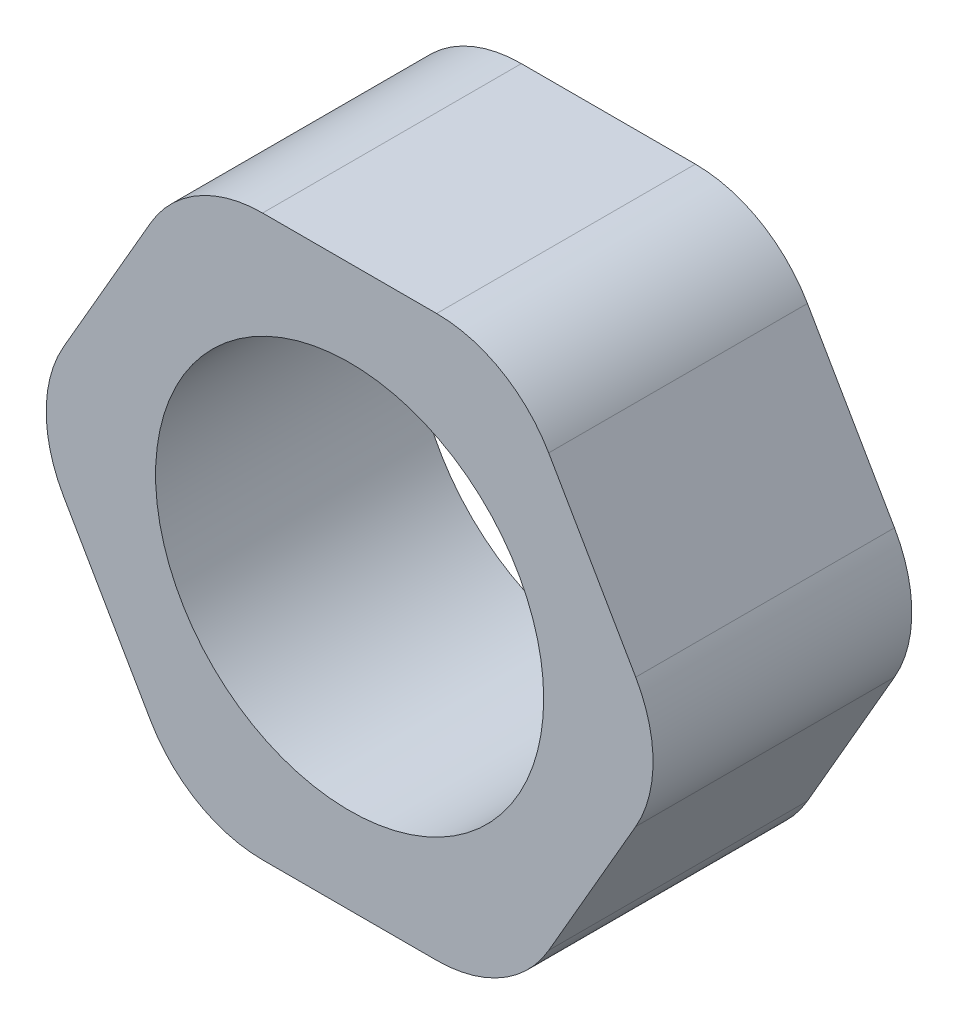
ISO-10303-21;
HEADER;
FILE_DESCRIPTION(('STEP AP214'),'2;1');
FILE_NAME('part.step','',(''),(''),'','','');
FILE_SCHEMA(('AUTOMOTIVE_DESIGN { 1 0 10303 214 1 1 1 1 }'));
ENDSEC;
DATA;
#1=APPLICATION_CONTEXT('core data for automotive mechanical design processes');
#2=APPLICATION_PROTOCOL_DEFINITION('international standard','automotive_design',2000,#1);
#3=PRODUCT_CONTEXT('',#1,'mechanical');
#4=PRODUCT('Part','Part','',(#3));
#5=PRODUCT_RELATED_PRODUCT_CATEGORY('part','',(#4));
#6=PRODUCT_DEFINITION_FORMATION('','',#4);
#7=PRODUCT_DEFINITION_CONTEXT('part definition',#1,'design');
#8=PRODUCT_DEFINITION('design','',#6,#7);
#9=PRODUCT_DEFINITION_SHAPE('','',#8);
#10=(LENGTH_UNIT() NAMED_UNIT(*) SI_UNIT(.MILLI.,.METRE.));
#11=(NAMED_UNIT(*) PLANE_ANGLE_UNIT() SI_UNIT($,.RADIAN.));
#12=(NAMED_UNIT(*) SI_UNIT($,.STERADIAN.) SOLID_ANGLE_UNIT());
#13=UNCERTAINTY_MEASURE_WITH_UNIT(LENGTH_MEASURE(1.E-05),#10,'distance_accuracy_value','');
#14=(GEOMETRIC_REPRESENTATION_CONTEXT(3) GLOBAL_UNCERTAINTY_ASSIGNED_CONTEXT((#13)) GLOBAL_UNIT_ASSIGNED_CONTEXT((#10,
#11,#12)) REPRESENTATION_CONTEXT('',''));
#15=CARTESIAN_POINT('',(0.,0.,0.));
#16=DIRECTION('',(0.,0.,1.));
#17=DIRECTION('',(1.,0.,0.));
#18=AXIS2_PLACEMENT_3D('',#15,#16,#17);
#19=CARTESIAN_POINT('',(0.,0.,2.));
#20=DIRECTION('',(0.,0.,1.));
#21=DIRECTION('',(1.,0.,0.));
#22=AXIS2_PLACEMENT_3D('',#19,#20,#21);
#23=PLANE('',#22);
#24=DIRECTION('',(0.5,0.866025403784439,0.));
#25=VECTOR('',#24,1.);
#26=CARTESIAN_POINT('',(1.25,-2.1650635094611,2.));
#27=LINE('',#26,#25);
#28=CARTESIAN_POINT('',(1.53867513459481,-1.6650635094611,2.));
#29=VERTEX_POINT('',#28);
#30=CARTESIAN_POINT('',(2.21132486540519,-0.5,2.));
#31=VERTEX_POINT('',#30);
#32=EDGE_CURVE('E168',#29,#31,#27,.T.);
#33=ORIENTED_EDGE('',*,*,#32,.T.);
#34=CARTESIAN_POINT('',(1.34529946162075,0.,2.));
#35=DIRECTION('',(0.,0.,1.));
#36=DIRECTION('',(1.,0.,0.));
#37=AXIS2_PLACEMENT_3D('',#34,#35,#36);
#38=CIRCLE('',#37,1.);
#39=CARTESIAN_POINT('',(2.21132486540519,0.5,2.));
#40=VERTEX_POINT('',#39);
#41=EDGE_CURVE('E201',#31,#40,#38,.T.);
#42=ORIENTED_EDGE('',*,*,#41,.T.);
#43=DIRECTION('',(-0.5,0.866025403784439,0.));
#44=VECTOR('',#43,1.);
#45=CARTESIAN_POINT('',(2.5,0.,2.));
#46=LINE('',#45,#44);
#47=CARTESIAN_POINT('',(1.53867513459481,1.6650635094611,2.));
#48=VERTEX_POINT('',#47);
#49=EDGE_CURVE('E151',#40,#48,#46,.T.);
#50=ORIENTED_EDGE('',*,*,#49,.T.);
#51=CARTESIAN_POINT('',(0.672649730810374,1.1650635094611,2.));
#52=DIRECTION('',(0.,0.,1.));
#53=DIRECTION('',(1.,0.,0.));
#54=AXIS2_PLACEMENT_3D('',#51,#52,#53);
#55=CIRCLE('',#54,1.);
#56=CARTESIAN_POINT('',(0.672649730810374,2.1650635094611,2.));
#57=VERTEX_POINT('',#56);
#58=EDGE_CURVE('E192',#48,#57,#55,.T.);
#59=ORIENTED_EDGE('',*,*,#58,.T.);
#60=DIRECTION('',(-1.,0.,0.));
#61=VECTOR('',#60,1.);
#62=CARTESIAN_POINT('',(1.25,2.1650635094611,2.));
#63=LINE('',#62,#61);
#64=CARTESIAN_POINT('',(-0.672649730810374,2.1650635094611,2.));
#65=VERTEX_POINT('',#64);
#66=EDGE_CURVE('E223',#57,#65,#63,.T.);
#67=ORIENTED_EDGE('',*,*,#66,.T.);
#68=CARTESIAN_POINT('',(-0.672649730810374,1.1650635094611,2.));
#69=DIRECTION('',(0.,0.,1.));
#70=DIRECTION('',(1.,0.,0.));
#71=AXIS2_PLACEMENT_3D('',#68,#69,#70);
#72=CIRCLE('',#71,1.);
#73=CARTESIAN_POINT('',(-1.53867513459481,1.6650635094611,2.));
#74=VERTEX_POINT('',#73);
#75=EDGE_CURVE('E194',#65,#74,#72,.T.);
#76=ORIENTED_EDGE('',*,*,#75,.T.);
#77=DIRECTION('',(-0.5,-0.866025403784439,0.));
#78=VECTOR('',#77,1.);
#79=CARTESIAN_POINT('',(-1.25,2.1650635094611,2.));
#80=LINE('',#79,#78);
#81=CARTESIAN_POINT('',(-2.21132486540519,0.5,2.));
#82=VERTEX_POINT('',#81);
#83=EDGE_CURVE('E236',#74,#82,#80,.T.);
#84=ORIENTED_EDGE('',*,*,#83,.T.);
#85=CARTESIAN_POINT('',(-1.34529946162075,0.,2.));
#86=DIRECTION('',(0.,0.,1.));
#87=DIRECTION('',(1.,0.,0.));
#88=AXIS2_PLACEMENT_3D('',#85,#86,#87);
#89=CIRCLE('',#88,1.);
#90=CARTESIAN_POINT('',(-2.21132486540519,-0.499999999999999,2.));
#91=VERTEX_POINT('',#90);
#92=EDGE_CURVE('E196',#82,#91,#89,.T.);
#93=ORIENTED_EDGE('',*,*,#92,.T.);
#94=DIRECTION('',(0.5,-0.866025403784439,0.));
#95=VECTOR('',#94,1.);
#96=CARTESIAN_POINT('',(-2.5,0.,2.));
#97=LINE('',#96,#95);
#98=CARTESIAN_POINT('',(-1.53867513459481,-1.6650635094611,2.));
#99=VERTEX_POINT('',#98);
#100=EDGE_CURVE('E238',#91,#99,#97,.T.);
#101=ORIENTED_EDGE('',*,*,#100,.T.);
#102=CARTESIAN_POINT('',(-0.672649730810374,-1.1650635094611,2.));
#103=DIRECTION('',(0.,0.,1.));
#104=DIRECTION('',(1.,0.,0.));
#105=AXIS2_PLACEMENT_3D('',#102,#103,#104);
#106=CIRCLE('',#105,1.);
#107=CARTESIAN_POINT('',(-0.672649730810374,-2.1650635094611,2.));
#108=VERTEX_POINT('',#107);
#109=EDGE_CURVE('E63',#99,#108,#106,.T.);
#110=ORIENTED_EDGE('',*,*,#109,.T.);
#111=DIRECTION('',(1.,0.,0.));
#112=VECTOR('',#111,1.);
#113=CARTESIAN_POINT('',(-1.25,-2.1650635094611,2.));
#114=LINE('',#113,#112);
#115=CARTESIAN_POINT('',(0.672649730810374,-2.1650635094611,2.));
#116=VERTEX_POINT('',#115);
#117=EDGE_CURVE('E240',#108,#116,#114,.T.);
#118=ORIENTED_EDGE('',*,*,#117,.T.);
#119=CARTESIAN_POINT('',(0.672649730810374,-1.1650635094611,2.));
#120=DIRECTION('',(0.,0.,1.));
#121=DIRECTION('',(1.,0.,0.));
#122=AXIS2_PLACEMENT_3D('',#119,#120,#121);
#123=CIRCLE('',#122,1.);
#124=EDGE_CURVE('E199',#116,#29,#123,.T.);
#125=ORIENTED_EDGE('',*,*,#124,.T.);
#126=EDGE_LOOP('',(#33,#42,#50,#59,#67,#76,#84,#93,#101,#110,#118,#125));
#127=FACE_BOUND('',#126,.T.);
#128=CARTESIAN_POINT('',(0.,0.,2.));
#129=DIRECTION('',(0.,0.,1.));
#130=DIRECTION('',(1.,0.,0.));
#131=AXIS2_PLACEMENT_3D('',#128,#129,#130);
#132=CIRCLE('',#131,1.5);
#133=CARTESIAN_POINT('',(1.5,0.,2.));
#134=VERTEX_POINT('',#133);
#135=EDGE_CURVE('E159',#134,#134,#132,.T.);
#136=ORIENTED_EDGE('',*,*,#135,.F.);
#137=EDGE_LOOP('',(#136));
#138=FACE_BOUND('',#137,.T.);
#139=ADVANCED_FACE('F41',(#127,#138),#23,.T.);
#140=CARTESIAN_POINT('',(0.,0.,0.));
#141=DIRECTION('',(0.,0.,1.));
#142=DIRECTION('',(1.,0.,0.));
#143=AXIS2_PLACEMENT_3D('',#140,#141,#142);
#144=PLANE('',#143);
#145=DIRECTION('',(-0.5,0.866025403784439,0.));
#146=VECTOR('',#145,1.);
#147=CARTESIAN_POINT('',(2.5,0.,0.));
#148=LINE('',#147,#146);
#149=CARTESIAN_POINT('',(2.21132486540519,0.5,0.));
#150=VERTEX_POINT('',#149);
#151=CARTESIAN_POINT('',(1.53867513459481,1.6650635094611,0.));
#152=VERTEX_POINT('',#151);
#153=EDGE_CURVE('E148',#150,#152,#148,.T.);
#154=ORIENTED_EDGE('',*,*,#153,.F.);
#155=CARTESIAN_POINT('',(1.34529946162075,0.,0.));
#156=DIRECTION('',(0.,0.,1.));
#157=DIRECTION('',(1.,0.,0.));
#158=AXIS2_PLACEMENT_3D('',#155,#156,#157);
#159=CIRCLE('',#158,1.);
#160=CARTESIAN_POINT('',(2.21132486540519,-0.5,0.));
#161=VERTEX_POINT('',#160);
#162=EDGE_CURVE('E131',#150,#161,#159,.F.);
#163=ORIENTED_EDGE('',*,*,#162,.T.);
#164=DIRECTION('',(0.5,0.866025403784439,0.));
#165=VECTOR('',#164,1.);
#166=CARTESIAN_POINT('',(1.25,-2.1650635094611,0.));
#167=LINE('',#166,#165);
#168=CARTESIAN_POINT('',(1.53867513459481,-1.6650635094611,0.));
#169=VERTEX_POINT('',#168);
#170=EDGE_CURVE('E178',#169,#161,#167,.T.);
#171=ORIENTED_EDGE('',*,*,#170,.F.);
#172=CARTESIAN_POINT('',(0.672649730810374,-1.1650635094611,0.));
#173=DIRECTION('',(0.,0.,1.));
#174=DIRECTION('',(1.,0.,0.));
#175=AXIS2_PLACEMENT_3D('',#172,#173,#174);
#176=CIRCLE('',#175,1.);
#177=CARTESIAN_POINT('',(0.672649730810374,-2.1650635094611,0.));
#178=VERTEX_POINT('',#177);
#179=EDGE_CURVE('E142',#169,#178,#176,.F.);
#180=ORIENTED_EDGE('',*,*,#179,.T.);
#181=DIRECTION('',(1.,0.,0.));
#182=VECTOR('',#181,1.);
#183=CARTESIAN_POINT('',(-1.25,-2.1650635094611,0.));
#184=LINE('',#183,#182);
#185=CARTESIAN_POINT('',(-0.672649730810374,-2.1650635094611,0.));
#186=VERTEX_POINT('',#185);
#187=EDGE_CURVE('E176',#186,#178,#184,.T.);
#188=ORIENTED_EDGE('',*,*,#187,.F.);
#189=CARTESIAN_POINT('',(-0.672649730810374,-1.1650635094611,0.));
#190=DIRECTION('',(0.,0.,1.));
#191=DIRECTION('',(1.,0.,0.));
#192=AXIS2_PLACEMENT_3D('',#189,#190,#191);
#193=CIRCLE('',#192,1.);
#194=CARTESIAN_POINT('',(-1.53867513459481,-1.6650635094611,0.));
#195=VERTEX_POINT('',#194);
#196=EDGE_CURVE('E186',#186,#195,#193,.F.);
#197=ORIENTED_EDGE('',*,*,#196,.T.);
#198=DIRECTION('',(0.5,-0.866025403784439,0.));
#199=VECTOR('',#198,1.);
#200=CARTESIAN_POINT('',(-2.5,0.,0.));
#201=LINE('',#200,#199);
#202=CARTESIAN_POINT('',(-2.21132486540519,-0.499999999999999,0.));
#203=VERTEX_POINT('',#202);
#204=EDGE_CURVE('E173',#203,#195,#201,.T.);
#205=ORIENTED_EDGE('',*,*,#204,.F.);
#206=CARTESIAN_POINT('',(-1.34529946162075,0.,0.));
#207=DIRECTION('',(0.,0.,1.));
#208=DIRECTION('',(1.,0.,0.));
#209=AXIS2_PLACEMENT_3D('',#206,#207,#208);
#210=CIRCLE('',#209,1.);
#211=CARTESIAN_POINT('',(-2.21132486540519,0.5,0.));
#212=VERTEX_POINT('',#211);
#213=EDGE_CURVE('E184',#203,#212,#210,.F.);
#214=ORIENTED_EDGE('',*,*,#213,.T.);
#215=DIRECTION('',(-0.5,-0.866025403784439,0.));
#216=VECTOR('',#215,1.);
#217=CARTESIAN_POINT('',(-1.25,2.1650635094611,0.));
#218=LINE('',#217,#216);
#219=CARTESIAN_POINT('',(-1.53867513459481,1.6650635094611,0.));
#220=VERTEX_POINT('',#219);
#221=EDGE_CURVE('E162',#220,#212,#218,.T.);
#222=ORIENTED_EDGE('',*,*,#221,.F.);
#223=CARTESIAN_POINT('',(-0.672649730810374,1.1650635094611,0.));
#224=DIRECTION('',(0.,0.,1.));
#225=DIRECTION('',(1.,0.,0.));
#226=AXIS2_PLACEMENT_3D('',#223,#224,#225);
#227=CIRCLE('',#226,1.);
#228=CARTESIAN_POINT('',(-0.672649730810374,2.1650635094611,0.));
#229=VERTEX_POINT('',#228);
#230=EDGE_CURVE('E182',#220,#229,#227,.F.);
#231=ORIENTED_EDGE('',*,*,#230,.T.);
#232=DIRECTION('',(-1.,0.,0.));
#233=VECTOR('',#232,1.);
#234=CARTESIAN_POINT('',(1.25,2.1650635094611,0.));
#235=LINE('',#234,#233);
#236=CARTESIAN_POINT('',(0.672649730810374,2.1650635094611,0.));
#237=VERTEX_POINT('',#236);
#238=EDGE_CURVE('E158',#237,#229,#235,.T.);
#239=ORIENTED_EDGE('',*,*,#238,.F.);
#240=CARTESIAN_POINT('',(0.672649730810374,1.1650635094611,0.));
#241=DIRECTION('',(0.,0.,1.));
#242=DIRECTION('',(1.,0.,0.));
#243=AXIS2_PLACEMENT_3D('',#240,#241,#242);
#244=CIRCLE('',#243,1.);
#245=EDGE_CURVE('E152',#237,#152,#244,.F.);
#246=ORIENTED_EDGE('',*,*,#245,.T.);
#247=EDGE_LOOP('',(#154,#163,#171,#180,#188,#197,#205,#214,#222,#231,#239,#246));
#248=FACE_BOUND('',#247,.T.);
#249=CARTESIAN_POINT('',(0.,0.,0.));
#250=DIRECTION('',(0.,0.,1.));
#251=DIRECTION('',(1.,0.,0.));
#252=AXIS2_PLACEMENT_3D('',#249,#250,#251);
#253=CIRCLE('',#252,1.5);
#254=CARTESIAN_POINT('',(1.5,0.,0.));
#255=VERTEX_POINT('',#254);
#256=EDGE_CURVE('E165',#255,#255,#253,.T.);
#257=ORIENTED_EDGE('',*,*,#256,.T.);
#258=EDGE_LOOP('',(#257));
#259=FACE_BOUND('',#258,.T.);
#260=ADVANCED_FACE('F155',(#248,#259),#144,.F.);
#261=CARTESIAN_POINT('',(2.5,0.,2.));
#262=DIRECTION('',(-0.866025403784439,-0.5,0.));
#263=DIRECTION('',(0.5,-0.866025403784439,0.));
#264=AXIS2_PLACEMENT_3D('',#261,#262,#263);
#265=PLANE('',#264);
#266=ORIENTED_EDGE('',*,*,#49,.F.);
#267=DIRECTION('',(0.,0.,-1.));
#268=VECTOR('',#267,1.);
#269=CARTESIAN_POINT('',(2.21132486540519,0.5,2.));
#270=LINE('',#269,#268);
#271=EDGE_CURVE('E135',#40,#150,#270,.T.);
#272=ORIENTED_EDGE('',*,*,#271,.T.);
#273=ORIENTED_EDGE('',*,*,#153,.T.);
#274=DIRECTION('',(0.,0.,-1.));
#275=VECTOR('',#274,1.);
#276=CARTESIAN_POINT('',(1.53867513459481,1.6650635094611,2.));
#277=LINE('',#276,#275);
#278=EDGE_CURVE('E153',#152,#48,#277,.F.);
#279=ORIENTED_EDGE('',*,*,#278,.T.);
#280=EDGE_LOOP('',(#266,#272,#273,#279));
#281=FACE_BOUND('',#280,.T.);
#282=ADVANCED_FACE('F147',(#281),#265,.F.);
#283=CARTESIAN_POINT('',(1.25,2.1650635094611,2.));
#284=DIRECTION('',(0.,-1.,0.));
#285=DIRECTION('',(0.,0.,-1.));
#286=AXIS2_PLACEMENT_3D('',#283,#284,#285);
#287=PLANE('',#286);
#288=ORIENTED_EDGE('',*,*,#238,.T.);
#289=DIRECTION('',(0.,0.,-1.));
#290=VECTOR('',#289,1.);
#291=CARTESIAN_POINT('',(-0.672649730810374,2.1650635094611,2.));
#292=LINE('',#291,#290);
#293=EDGE_CURVE('E11',#229,#65,#292,.F.);
#294=ORIENTED_EDGE('',*,*,#293,.T.);
#295=ORIENTED_EDGE('',*,*,#66,.F.);
#296=DIRECTION('',(0.,0.,-1.));
#297=VECTOR('',#296,1.);
#298=CARTESIAN_POINT('',(0.672649730810374,2.1650635094611,2.));
#299=LINE('',#298,#297);
#300=EDGE_CURVE('E49',#57,#237,#299,.T.);
#301=ORIENTED_EDGE('',*,*,#300,.T.);
#302=EDGE_LOOP('',(#288,#294,#295,#301));
#303=FACE_BOUND('',#302,.T.);
#304=ADVANCED_FACE('F220',(#303),#287,.F.);
#305=CARTESIAN_POINT('',(-1.25,2.1650635094611,2.));
#306=DIRECTION('',(0.866025403784439,-0.5,0.));
#307=DIRECTION('',(0.5,0.866025403784439,0.));
#308=AXIS2_PLACEMENT_3D('',#305,#306,#307);
#309=PLANE('',#308);
#310=ORIENTED_EDGE('',*,*,#221,.T.);
#311=DIRECTION('',(0.,0.,-1.));
#312=VECTOR('',#311,1.);
#313=CARTESIAN_POINT('',(-2.21132486540519,0.5,2.));
#314=LINE('',#313,#312);
#315=EDGE_CURVE('E215',#212,#82,#314,.F.);
#316=ORIENTED_EDGE('',*,*,#315,.T.);
#317=ORIENTED_EDGE('',*,*,#83,.F.);
#318=DIRECTION('',(0.,0.,-1.));
#319=VECTOR('',#318,1.);
#320=CARTESIAN_POINT('',(-1.53867513459481,1.6650635094611,2.));
#321=LINE('',#320,#319);
#322=EDGE_CURVE('E212',#74,#220,#321,.T.);
#323=ORIENTED_EDGE('',*,*,#322,.T.);
#324=EDGE_LOOP('',(#310,#316,#317,#323));
#325=FACE_BOUND('',#324,.T.);
#326=ADVANCED_FACE('F233',(#325),#309,.F.);
#327=CARTESIAN_POINT('',(-2.5,0.,2.));
#328=DIRECTION('',(0.866025403784439,0.5,0.));
#329=DIRECTION('',(-0.5,0.866025403784439,0.));
#330=AXIS2_PLACEMENT_3D('',#327,#328,#329);
#331=PLANE('',#330);
#332=ORIENTED_EDGE('',*,*,#204,.T.);
#333=DIRECTION('',(0.,0.,-1.));
#334=VECTOR('',#333,1.);
#335=CARTESIAN_POINT('',(-1.53867513459481,-1.6650635094611,2.));
#336=LINE('',#335,#334);
#337=EDGE_CURVE('E210',#195,#99,#336,.F.);
#338=ORIENTED_EDGE('',*,*,#337,.T.);
#339=ORIENTED_EDGE('',*,*,#100,.F.);
#340=DIRECTION('',(0.,0.,-1.));
#341=VECTOR('',#340,1.);
#342=CARTESIAN_POINT('',(-2.21132486540519,-0.5,2.));
#343=LINE('',#342,#341);
#344=EDGE_CURVE('E207',#91,#203,#343,.T.);
#345=ORIENTED_EDGE('',*,*,#344,.T.);
#346=EDGE_LOOP('',(#332,#338,#339,#345));
#347=FACE_BOUND('',#346,.T.);
#348=ADVANCED_FACE('F261',(#347),#331,.F.);
#349=CARTESIAN_POINT('',(-1.25,-2.1650635094611,2.));
#350=DIRECTION('',(0.,1.,0.));
#351=DIRECTION('',(0.,0.,1.));
#352=AXIS2_PLACEMENT_3D('',#349,#350,#351);
#353=PLANE('',#352);
#354=ORIENTED_EDGE('',*,*,#187,.T.);
#355=DIRECTION('',(0.,0.,-1.));
#356=VECTOR('',#355,1.);
#357=CARTESIAN_POINT('',(0.672649730810374,-2.1650635094611,2.));
#358=LINE('',#357,#356);
#359=EDGE_CURVE('E56',#178,#116,#358,.F.);
#360=ORIENTED_EDGE('',*,*,#359,.T.);
#361=ORIENTED_EDGE('',*,*,#117,.F.);
#362=DIRECTION('',(0.,0.,-1.));
#363=VECTOR('',#362,1.);
#364=CARTESIAN_POINT('',(-0.672649730810374,-2.1650635094611,2.));
#365=LINE('',#364,#363);
#366=EDGE_CURVE('E203',#108,#186,#365,.T.);
#367=ORIENTED_EDGE('',*,*,#366,.T.);
#368=EDGE_LOOP('',(#354,#360,#361,#367));
#369=FACE_BOUND('',#368,.T.);
#370=ADVANCED_FACE('F254',(#369),#353,.F.);
#371=CARTESIAN_POINT('',(1.25,-2.1650635094611,2.));
#372=DIRECTION('',(-0.866025403784439,0.5,0.));
#373=DIRECTION('',(-0.5,-0.866025403784439,0.));
#374=AXIS2_PLACEMENT_3D('',#371,#372,#373);
#375=PLANE('',#374);
#376=ORIENTED_EDGE('',*,*,#170,.T.);
#377=DIRECTION('',(0.,0.,-1.));
#378=VECTOR('',#377,1.);
#379=CARTESIAN_POINT('',(2.21132486540519,-0.5,2.));
#380=LINE('',#379,#378);
#381=EDGE_CURVE('E136',#161,#31,#380,.F.);
#382=ORIENTED_EDGE('',*,*,#381,.T.);
#383=ORIENTED_EDGE('',*,*,#32,.F.);
#384=DIRECTION('',(0.,0.,-1.));
#385=VECTOR('',#384,1.);
#386=CARTESIAN_POINT('',(1.53867513459481,-1.6650635094611,2.));
#387=LINE('',#386,#385);
#388=EDGE_CURVE('E141',#29,#169,#387,.T.);
#389=ORIENTED_EDGE('',*,*,#388,.T.);
#390=EDGE_LOOP('',(#376,#382,#383,#389));
#391=FACE_BOUND('',#390,.T.);
#392=ADVANCED_FACE('F250',(#391),#375,.F.);
#393=CARTESIAN_POINT('',(0.,0.,2.));
#394=DIRECTION('',(0.,0.,-1.));
#395=DIRECTION('',(-1.,0.,0.));
#396=AXIS2_PLACEMENT_3D('',#393,#394,#395);
#397=CYLINDRICAL_SURFACE('',#396,1.5);
#398=ORIENTED_EDGE('',*,*,#135,.T.);
#399=EDGE_LOOP('',(#398));
#400=FACE_BOUND('',#399,.T.);
#401=ORIENTED_EDGE('',*,*,#256,.F.);
#402=EDGE_LOOP('',(#401));
#403=FACE_BOUND('',#402,.T.);
#404=ADVANCED_FACE('F281',(#400,#403),#397,.F.);
#405=CARTESIAN_POINT('',(1.34529946162075,0.,2.));
#406=DIRECTION('',(0.,0.,-1.));
#407=DIRECTION('',(-1.,0.,0.));
#408=AXIS2_PLACEMENT_3D('',#405,#406,#407);
#409=CYLINDRICAL_SURFACE('',#408,1.);
#410=ORIENTED_EDGE('',*,*,#41,.F.);
#411=ORIENTED_EDGE('',*,*,#381,.F.);
#412=ORIENTED_EDGE('',*,*,#162,.F.);
#413=ORIENTED_EDGE('',*,*,#271,.F.);
#414=EDGE_LOOP('',(#410,#411,#412,#413));
#415=FACE_BOUND('',#414,.T.);
#416=ADVANCED_FACE('F134',(#415),#409,.T.);
#417=CARTESIAN_POINT('',(0.672649730810374,-1.1650635094611,2.));
#418=DIRECTION('',(0.,0.,-1.));
#419=DIRECTION('',(-1.,0.,0.));
#420=AXIS2_PLACEMENT_3D('',#417,#418,#419);
#421=CYLINDRICAL_SURFACE('',#420,1.);
#422=ORIENTED_EDGE('',*,*,#124,.F.);
#423=ORIENTED_EDGE('',*,*,#359,.F.);
#424=ORIENTED_EDGE('',*,*,#179,.F.);
#425=ORIENTED_EDGE('',*,*,#388,.F.);
#426=EDGE_LOOP('',(#422,#423,#424,#425));
#427=FACE_BOUND('',#426,.T.);
#428=ADVANCED_FACE('F252',(#427),#421,.T.);
#429=CARTESIAN_POINT('',(-0.672649730810374,-1.1650635094611,2.));
#430=DIRECTION('',(0.,0.,-1.));
#431=DIRECTION('',(-1.,0.,0.));
#432=AXIS2_PLACEMENT_3D('',#429,#430,#431);
#433=CYLINDRICAL_SURFACE('',#432,1.);
#434=ORIENTED_EDGE('',*,*,#109,.F.);
#435=ORIENTED_EDGE('',*,*,#337,.F.);
#436=ORIENTED_EDGE('',*,*,#196,.F.);
#437=ORIENTED_EDGE('',*,*,#366,.F.);
#438=EDGE_LOOP('',(#434,#435,#436,#437));
#439=FACE_BOUND('',#438,.T.);
#440=ADVANCED_FACE('F257',(#439),#433,.T.);
#441=CARTESIAN_POINT('',(-1.34529946162075,0.,2.));
#442=DIRECTION('',(0.,0.,-1.));
#443=DIRECTION('',(-1.,0.,0.));
#444=AXIS2_PLACEMENT_3D('',#441,#442,#443);
#445=CYLINDRICAL_SURFACE('',#444,1.);
#446=ORIENTED_EDGE('',*,*,#92,.F.);
#447=ORIENTED_EDGE('',*,*,#315,.F.);
#448=ORIENTED_EDGE('',*,*,#213,.F.);
#449=ORIENTED_EDGE('',*,*,#344,.F.);
#450=EDGE_LOOP('',(#446,#447,#448,#449));
#451=FACE_BOUND('',#450,.T.);
#452=ADVANCED_FACE('F265',(#451),#445,.T.);
#453=CARTESIAN_POINT('',(-0.672649730810374,1.1650635094611,2.));
#454=DIRECTION('',(0.,0.,-1.));
#455=DIRECTION('',(-1.,0.,0.));
#456=AXIS2_PLACEMENT_3D('',#453,#454,#455);
#457=CYLINDRICAL_SURFACE('',#456,1.);
#458=ORIENTED_EDGE('',*,*,#75,.F.);
#459=ORIENTED_EDGE('',*,*,#293,.F.);
#460=ORIENTED_EDGE('',*,*,#230,.F.);
#461=ORIENTED_EDGE('',*,*,#322,.F.);
#462=EDGE_LOOP('',(#458,#459,#460,#461));
#463=FACE_BOUND('',#462,.T.);
#464=ADVANCED_FACE('F230',(#463),#457,.T.);
#465=CARTESIAN_POINT('',(0.672649730810374,1.1650635094611,2.));
#466=DIRECTION('',(0.,0.,-1.));
#467=DIRECTION('',(-1.,0.,0.));
#468=AXIS2_PLACEMENT_3D('',#465,#466,#467);
#469=CYLINDRICAL_SURFACE('',#468,1.);
#470=ORIENTED_EDGE('',*,*,#58,.F.);
#471=ORIENTED_EDGE('',*,*,#278,.F.);
#472=ORIENTED_EDGE('',*,*,#245,.F.);
#473=ORIENTED_EDGE('',*,*,#300,.F.);
#474=EDGE_LOOP('',(#470,#471,#472,#473));
#475=FACE_BOUND('',#474,.T.);
#476=ADVANCED_FACE('F43',(#475),#469,.T.);
#477=CLOSED_SHELL('',(#139,#260,#282,#304,#326,#348,#370,#392,#404,#416,#428,#440,#452,#464,#476));
#478=MANIFOLD_SOLID_BREP('B2',#477);
#479=ADVANCED_BREP_SHAPE_REPRESENTATION('',(#18,#478),#14);
#480=SHAPE_DEFINITION_REPRESENTATION(#9,#479);
ENDSEC;
END-ISO-10303-21;
